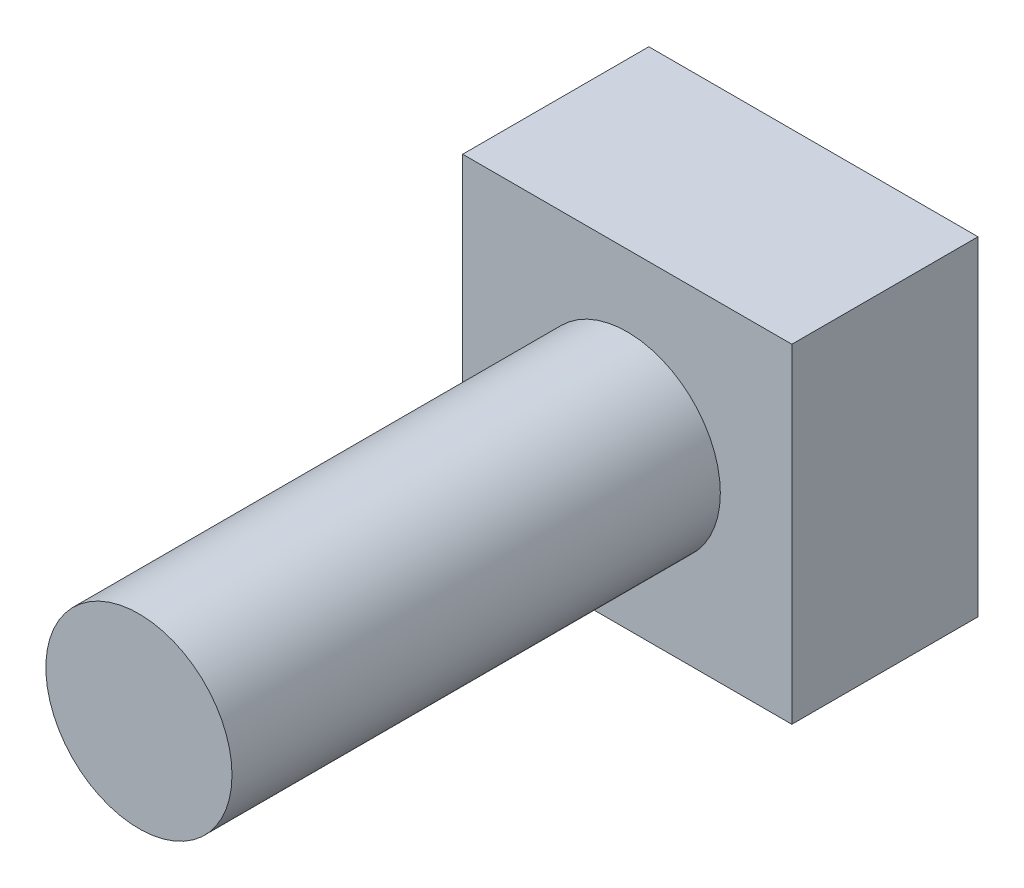
ISO-10303-21;
HEADER;
FILE_DESCRIPTION(('STEP AP214'),'2;1');
FILE_NAME('part.step','',(''),(''),'','','');
FILE_SCHEMA(('AUTOMOTIVE_DESIGN { 1 0 10303 214 1 1 1 1 }'));
ENDSEC;
DATA;
#1=APPLICATION_CONTEXT('core data for automotive mechanical design processes');
#2=APPLICATION_PROTOCOL_DEFINITION('international standard','automotive_design',2000,#1);
#3=PRODUCT_CONTEXT('',#1,'mechanical');
#4=PRODUCT('Part','Part','',(#3));
#5=PRODUCT_RELATED_PRODUCT_CATEGORY('part','',(#4));
#6=PRODUCT_DEFINITION_FORMATION('','',#4);
#7=PRODUCT_DEFINITION_CONTEXT('part definition',#1,'design');
#8=PRODUCT_DEFINITION('design','',#6,#7);
#9=PRODUCT_DEFINITION_SHAPE('','',#8);
#10=(LENGTH_UNIT() NAMED_UNIT(*) SI_UNIT(.MILLI.,.METRE.));
#11=(NAMED_UNIT(*) PLANE_ANGLE_UNIT() SI_UNIT($,.RADIAN.));
#12=(NAMED_UNIT(*) SI_UNIT($,.STERADIAN.) SOLID_ANGLE_UNIT());
#13=UNCERTAINTY_MEASURE_WITH_UNIT(LENGTH_MEASURE(1.E-05),#10,'distance_accuracy_value','');
#14=(GEOMETRIC_REPRESENTATION_CONTEXT(3) GLOBAL_UNCERTAINTY_ASSIGNED_CONTEXT((#13)) GLOBAL_UNIT_ASSIGNED_CONTEXT((#10,
#11,#12)) REPRESENTATION_CONTEXT('',''));
#15=CARTESIAN_POINT('',(0.,0.,0.));
#16=DIRECTION('',(0.,0.,1.));
#17=DIRECTION('',(1.,0.,0.));
#18=AXIS2_PLACEMENT_3D('',#15,#16,#17);
#19=CARTESIAN_POINT('',(0.,0.,0.));
#20=DIRECTION('',(0.,0.,1.));
#21=DIRECTION('',(1.,0.,0.));
#22=AXIS2_PLACEMENT_3D('',#19,#20,#21);
#23=PLANE('',#22);
#24=DIRECTION('',(0.,-1.,0.));
#25=VECTOR('',#24,1.);
#26=CARTESIAN_POINT('',(-3.0988,-3.0988,0.));
#27=LINE('',#26,#25);
#28=CARTESIAN_POINT('',(-3.0988,3.0988,0.));
#29=VERTEX_POINT('',#28);
#30=CARTESIAN_POINT('',(-3.0988,-3.0988,0.));
#31=VERTEX_POINT('',#30);
#32=EDGE_CURVE('E101',#29,#31,#27,.T.);
#33=ORIENTED_EDGE('',*,*,#32,.T.);
#34=DIRECTION('',(1.,0.,0.));
#35=VECTOR('',#34,1.);
#36=CARTESIAN_POINT('',(3.0988,-3.0988,0.));
#37=LINE('',#36,#35);
#38=CARTESIAN_POINT('',(3.0988,-3.0988,0.));
#39=VERTEX_POINT('',#38);
#40=EDGE_CURVE('E104',#31,#39,#37,.T.);
#41=ORIENTED_EDGE('',*,*,#40,.T.);
#42=DIRECTION('',(0.,1.,0.));
#43=VECTOR('',#42,1.);
#44=CARTESIAN_POINT('',(3.0988,-3.0988,0.));
#45=LINE('',#44,#43);
#46=CARTESIAN_POINT('',(3.0988,3.0988,0.));
#47=VERTEX_POINT('',#46);
#48=EDGE_CURVE('E86',#39,#47,#45,.T.);
#49=ORIENTED_EDGE('',*,*,#48,.T.);
#50=DIRECTION('',(-1.,0.,0.));
#51=VECTOR('',#50,1.);
#52=CARTESIAN_POINT('',(3.0988,3.0988,0.));
#53=LINE('',#52,#51);
#54=EDGE_CURVE('E96',#47,#29,#53,.T.);
#55=ORIENTED_EDGE('',*,*,#54,.T.);
#56=EDGE_LOOP('',(#33,#41,#49,#55));
#57=FACE_BOUND('',#56,.T.);
#58=CARTESIAN_POINT('',(0.,0.,0.));
#59=DIRECTION('',(0.,0.,1.));
#60=DIRECTION('',(1.,0.,0.));
#61=AXIS2_PLACEMENT_3D('',#58,#59,#60);
#62=CIRCLE('',#61,1.7526);
#63=CARTESIAN_POINT('',(1.7526,0.,0.));
#64=VERTEX_POINT('',#63);
#65=EDGE_CURVE('E138',#64,#64,#62,.T.);
#66=ORIENTED_EDGE('',*,*,#65,.F.);
#67=EDGE_LOOP('',(#66));
#68=FACE_BOUND('',#67,.T.);
#69=ADVANCED_FACE('F35',(#57,#68),#23,.T.);
#70=CARTESIAN_POINT('',(-3.0988,-3.0988,-3.5052));
#71=DIRECTION('',(-1.,0.,0.));
#72=DIRECTION('',(0.,0.,1.));
#73=AXIS2_PLACEMENT_3D('',#70,#71,#72);
#74=PLANE('',#73);
#75=ORIENTED_EDGE('',*,*,#32,.F.);
#76=DIRECTION('',(0.,0.,1.));
#77=VECTOR('',#76,1.);
#78=CARTESIAN_POINT('',(-3.0988,3.0988,-3.5052));
#79=LINE('',#78,#77);
#80=CARTESIAN_POINT('',(-3.0988,3.0988,-3.5052));
#81=VERTEX_POINT('',#80);
#82=EDGE_CURVE('E11',#81,#29,#79,.T.);
#83=ORIENTED_EDGE('',*,*,#82,.F.);
#84=DIRECTION('',(0.,-1.,0.));
#85=VECTOR('',#84,1.);
#86=CARTESIAN_POINT('',(-3.0988,-3.0988,-3.5052));
#87=LINE('',#86,#85);
#88=CARTESIAN_POINT('',(-3.0988,-3.0988,-3.5052));
#89=VERTEX_POINT('',#88);
#90=EDGE_CURVE('E94',#81,#89,#87,.T.);
#91=ORIENTED_EDGE('',*,*,#90,.T.);
#92=DIRECTION('',(0.,0.,1.));
#93=VECTOR('',#92,1.);
#94=CARTESIAN_POINT('',(-3.0988,-3.0988,-3.5052));
#95=LINE('',#94,#93);
#96=EDGE_CURVE('E39',#89,#31,#95,.T.);
#97=ORIENTED_EDGE('',*,*,#96,.T.);
#98=EDGE_LOOP('',(#75,#83,#91,#97));
#99=FACE_BOUND('',#98,.T.);
#100=ADVANCED_FACE('F37',(#99),#74,.T.);
#101=CARTESIAN_POINT('',(3.0988,3.0988,-3.5052));
#102=DIRECTION('',(0.,1.,0.));
#103=DIRECTION('',(-1.,0.,0.));
#104=AXIS2_PLACEMENT_3D('',#101,#102,#103);
#105=PLANE('',#104);
#106=ORIENTED_EDGE('',*,*,#54,.F.);
#107=DIRECTION('',(0.,0.,1.));
#108=VECTOR('',#107,1.);
#109=CARTESIAN_POINT('',(3.0988,3.0988,-3.5052));
#110=LINE('',#109,#108);
#111=CARTESIAN_POINT('',(3.0988,3.0988,-3.5052));
#112=VERTEX_POINT('',#111);
#113=EDGE_CURVE('E45',#112,#47,#110,.T.);
#114=ORIENTED_EDGE('',*,*,#113,.F.);
#115=DIRECTION('',(-1.,0.,0.));
#116=VECTOR('',#115,1.);
#117=CARTESIAN_POINT('',(3.0988,3.0988,-3.5052));
#118=LINE('',#117,#116);
#119=EDGE_CURVE('E91',#112,#81,#118,.T.);
#120=ORIENTED_EDGE('',*,*,#119,.T.);
#121=ORIENTED_EDGE('',*,*,#82,.T.);
#122=EDGE_LOOP('',(#106,#114,#120,#121));
#123=FACE_BOUND('',#122,.T.);
#124=ADVANCED_FACE('F112',(#123),#105,.T.);
#125=CARTESIAN_POINT('',(3.0988,-3.0988,-3.5052));
#126=DIRECTION('',(1.,0.,0.));
#127=DIRECTION('',(0.,0.,-1.));
#128=AXIS2_PLACEMENT_3D('',#125,#126,#127);
#129=PLANE('',#128);
#130=ORIENTED_EDGE('',*,*,#48,.F.);
#131=DIRECTION('',(0.,0.,1.));
#132=VECTOR('',#131,1.);
#133=CARTESIAN_POINT('',(3.0988,-3.0988,-3.5052));
#134=LINE('',#133,#132);
#135=CARTESIAN_POINT('',(3.0988,-3.0988,-3.5052));
#136=VERTEX_POINT('',#135);
#137=EDGE_CURVE('E81',#136,#39,#134,.T.);
#138=ORIENTED_EDGE('',*,*,#137,.F.);
#139=DIRECTION('',(0.,1.,0.));
#140=VECTOR('',#139,1.);
#141=CARTESIAN_POINT('',(3.0988,-3.0988,-3.5052));
#142=LINE('',#141,#140);
#143=EDGE_CURVE('E84',#136,#112,#142,.T.);
#144=ORIENTED_EDGE('',*,*,#143,.T.);
#145=ORIENTED_EDGE('',*,*,#113,.T.);
#146=EDGE_LOOP('',(#130,#138,#144,#145));
#147=FACE_BOUND('',#146,.T.);
#148=ADVANCED_FACE('F83',(#147),#129,.T.);
#149=CARTESIAN_POINT('',(3.0988,-3.0988,-3.5052));
#150=DIRECTION('',(0.,-1.,0.));
#151=DIRECTION('',(1.,0.,0.));
#152=AXIS2_PLACEMENT_3D('',#149,#150,#151);
#153=PLANE('',#152);
#154=ORIENTED_EDGE('',*,*,#40,.F.);
#155=ORIENTED_EDGE('',*,*,#96,.F.);
#156=DIRECTION('',(1.,0.,0.));
#157=VECTOR('',#156,1.);
#158=CARTESIAN_POINT('',(3.0988,-3.0988,-3.5052));
#159=LINE('',#158,#157);
#160=EDGE_CURVE('E90',#89,#136,#159,.T.);
#161=ORIENTED_EDGE('',*,*,#160,.T.);
#162=ORIENTED_EDGE('',*,*,#137,.T.);
#163=EDGE_LOOP('',(#154,#155,#161,#162));
#164=FACE_BOUND('',#163,.T.);
#165=ADVANCED_FACE('F93',(#164),#153,.T.);
#166=CARTESIAN_POINT('',(0.,0.,-3.5052));
#167=DIRECTION('',(0.,0.,1.));
#168=DIRECTION('',(1.,0.,0.));
#169=AXIS2_PLACEMENT_3D('',#166,#167,#168);
#170=PLANE('',#169);
#171=ORIENTED_EDGE('',*,*,#90,.F.);
#172=ORIENTED_EDGE('',*,*,#119,.F.);
#173=ORIENTED_EDGE('',*,*,#143,.F.);
#174=ORIENTED_EDGE('',*,*,#160,.F.);
#175=EDGE_LOOP('',(#171,#172,#173,#174));
#176=FACE_BOUND('',#175,.T.);
#177=ADVANCED_FACE('F89',(#176),#170,.F.);
#178=CARTESIAN_POINT('',(0.,0.,9.1948));
#179=DIRECTION('',(0.,0.,-1.));
#180=DIRECTION('',(-1.,0.,0.));
#181=AXIS2_PLACEMENT_3D('',#178,#179,#180);
#182=CYLINDRICAL_SURFACE('',#181,1.7526);
#183=CARTESIAN_POINT('',(0.,0.,9.1948));
#184=DIRECTION('',(0.,0.,1.));
#185=DIRECTION('',(1.,0.,0.));
#186=AXIS2_PLACEMENT_3D('',#183,#184,#185);
#187=CIRCLE('',#186,1.7526);
#188=CARTESIAN_POINT('',(1.7526,0.,9.1948));
#189=VERTEX_POINT('',#188);
#190=EDGE_CURVE('E105',#189,#189,#187,.T.);
#191=ORIENTED_EDGE('',*,*,#190,.F.);
#192=EDGE_LOOP('',(#191));
#193=FACE_BOUND('',#192,.T.);
#194=ORIENTED_EDGE('',*,*,#65,.T.);
#195=EDGE_LOOP('',(#194));
#196=FACE_BOUND('',#195,.T.);
#197=ADVANCED_FACE('F127',(#193,#196),#182,.T.);
#198=CARTESIAN_POINT('',(0.,0.,9.1948));
#199=DIRECTION('',(0.,0.,1.));
#200=DIRECTION('',(1.,0.,0.));
#201=AXIS2_PLACEMENT_3D('',#198,#199,#200);
#202=PLANE('',#201);
#203=ORIENTED_EDGE('',*,*,#190,.T.);
#204=EDGE_LOOP('',(#203));
#205=FACE_BOUND('',#204,.T.);
#206=ADVANCED_FACE('F130',(#205),#202,.T.);
#207=CLOSED_SHELL('',(#69,#100,#124,#148,#165,#177,#197,#206));
#208=MANIFOLD_SOLID_BREP('B2',#207);
#209=ADVANCED_BREP_SHAPE_REPRESENTATION('',(#18,#208),#14);
#210=SHAPE_DEFINITION_REPRESENTATION(#9,#209);
ENDSEC;
END-ISO-10303-21;
